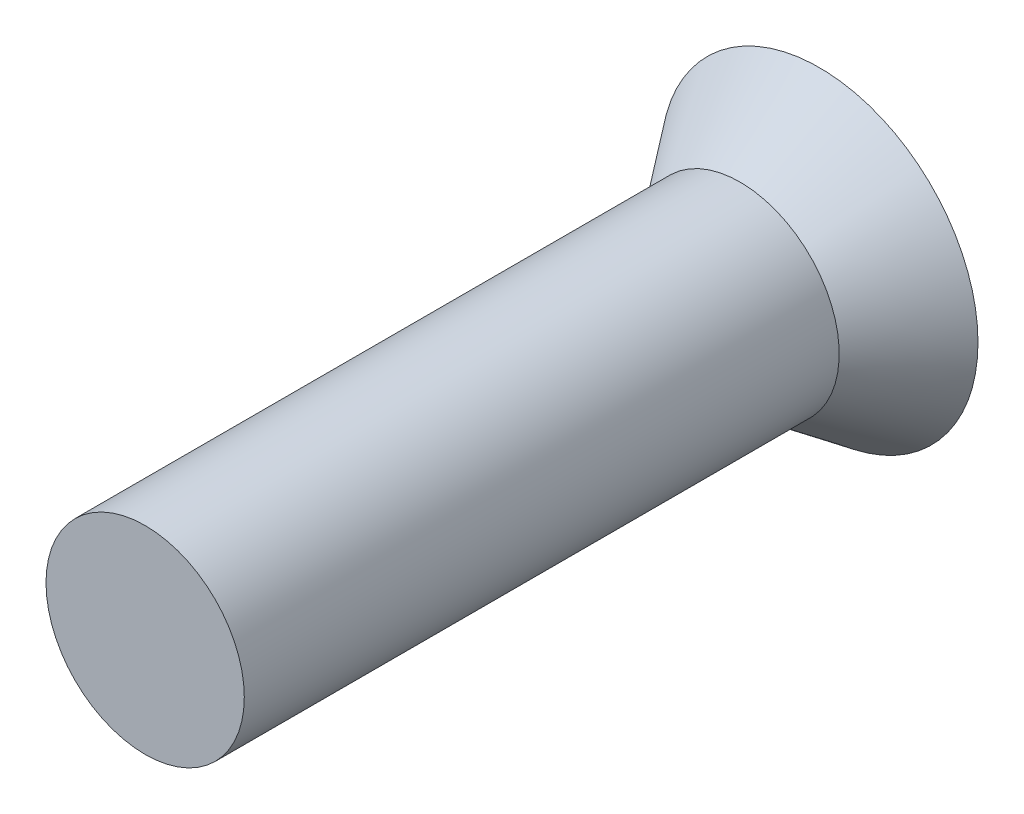
ISO-10303-21;
HEADER;
FILE_DESCRIPTION(('STEP AP214'),'2;1');
FILE_NAME('part.step','',(''),(''),'','','');
FILE_SCHEMA(('AUTOMOTIVE_DESIGN { 1 0 10303 214 1 1 1 1 }'));
ENDSEC;
DATA;
#1=APPLICATION_CONTEXT('core data for automotive mechanical design processes');
#2=APPLICATION_PROTOCOL_DEFINITION('international standard','automotive_design',2000,#1);
#3=PRODUCT_CONTEXT('',#1,'mechanical');
#4=PRODUCT('Part','Part','',(#3));
#5=PRODUCT_RELATED_PRODUCT_CATEGORY('part','',(#4));
#6=PRODUCT_DEFINITION_FORMATION('','',#4);
#7=PRODUCT_DEFINITION_CONTEXT('part definition',#1,'design');
#8=PRODUCT_DEFINITION('design','',#6,#7);
#9=PRODUCT_DEFINITION_SHAPE('','',#8);
#10=(LENGTH_UNIT() NAMED_UNIT(*) SI_UNIT(.MILLI.,.METRE.));
#11=(NAMED_UNIT(*) PLANE_ANGLE_UNIT() SI_UNIT($,.RADIAN.));
#12=(NAMED_UNIT(*) SI_UNIT($,.STERADIAN.) SOLID_ANGLE_UNIT());
#13=UNCERTAINTY_MEASURE_WITH_UNIT(LENGTH_MEASURE(1.E-05),#10,'distance_accuracy_value','');
#14=(GEOMETRIC_REPRESENTATION_CONTEXT(3) GLOBAL_UNCERTAINTY_ASSIGNED_CONTEXT((#13)) GLOBAL_UNIT_ASSIGNED_CONTEXT((#10,
#11,#12)) REPRESENTATION_CONTEXT('',''));
#15=CARTESIAN_POINT('',(0.,0.,0.));
#16=DIRECTION('',(0.,0.,1.));
#17=DIRECTION('',(1.,0.,0.));
#18=AXIS2_PLACEMENT_3D('',#15,#16,#17);
#19=CARTESIAN_POINT('',(0.,0.,17.));
#20=DIRECTION('',(0.,0.,-1.));
#21=DIRECTION('',(-1.,0.,0.));
#22=AXIS2_PLACEMENT_3D('',#19,#20,#21);
#23=CYLINDRICAL_SURFACE('',#22,2.5);
#24=CARTESIAN_POINT('',(0.,0.,17.));
#25=DIRECTION('',(0.,0.,1.));
#26=DIRECTION('',(1.,0.,0.));
#27=AXIS2_PLACEMENT_3D('',#24,#25,#26);
#28=CIRCLE('',#27,2.5);
#29=CARTESIAN_POINT('',(2.5,0.,17.));
#30=VERTEX_POINT('',#29);
#31=EDGE_CURVE('E10',#30,#30,#28,.T.);
#32=ORIENTED_EDGE('',*,*,#31,.F.);
#33=EDGE_LOOP('',(#32));
#34=FACE_BOUND('',#33,.T.);
#35=CARTESIAN_POINT('',(0.,0.,2.));
#36=DIRECTION('',(0.,0.,-1.));
#37=DIRECTION('',(-1.,0.,0.));
#38=AXIS2_PLACEMENT_3D('',#35,#36,#37);
#39=CIRCLE('',#38,2.5);
#40=CARTESIAN_POINT('',(-2.5,0.,2.));
#41=VERTEX_POINT('',#40);
#42=EDGE_CURVE('E51',#41,#41,#39,.T.);
#43=ORIENTED_EDGE('',*,*,#42,.F.);
#44=EDGE_LOOP('',(#43));
#45=FACE_BOUND('',#44,.T.);
#46=ADVANCED_FACE('F43',(#34,#45),#23,.T.);
#47=CARTESIAN_POINT('',(0.,0.,17.));
#48=DIRECTION('',(0.,0.,1.));
#49=DIRECTION('',(1.,0.,0.));
#50=AXIS2_PLACEMENT_3D('',#47,#48,#49);
#51=PLANE('',#50);
#52=ORIENTED_EDGE('',*,*,#31,.T.);
#53=EDGE_LOOP('',(#52));
#54=FACE_BOUND('',#53,.T.);
#55=ADVANCED_FACE('F66',(#54),#51,.T.);
#56=CARTESIAN_POINT('',(0.,0.,0.));
#57=DIRECTION('',(0.,0.,-1.));
#58=DIRECTION('',(-1.,0.,0.));
#59=AXIS2_PLACEMENT_3D('',#56,#57,#58);
#60=CONICAL_SURFACE('',#59,4.,0.643501108793284);
#61=ORIENTED_EDGE('',*,*,#42,.T.);
#62=EDGE_LOOP('',(#61));
#63=FACE_BOUND('',#62,.T.);
#64=CARTESIAN_POINT('',(0.,0.,0.));
#65=DIRECTION('',(0.,0.,-1.));
#66=DIRECTION('',(-1.,0.,0.));
#67=AXIS2_PLACEMENT_3D('',#64,#65,#66);
#68=CIRCLE('',#67,4.);
#69=CARTESIAN_POINT('',(-4.,0.,0.));
#70=VERTEX_POINT('',#69);
#71=EDGE_CURVE('E57',#70,#70,#68,.T.);
#72=ORIENTED_EDGE('',*,*,#71,.F.);
#73=EDGE_LOOP('',(#72));
#74=FACE_BOUND('',#73,.T.);
#75=ADVANCED_FACE('F61',(#63,#74),#60,.T.);
#76=CARTESIAN_POINT('',(0.,0.,0.));
#77=DIRECTION('',(0.,0.,1.));
#78=DIRECTION('',(1.,0.,0.));
#79=AXIS2_PLACEMENT_3D('',#76,#77,#78);
#80=PLANE('',#79);
#81=ORIENTED_EDGE('',*,*,#71,.T.);
#82=EDGE_LOOP('',(#81));
#83=FACE_BOUND('',#82,.T.);
#84=ADVANCED_FACE('F44',(#83),#80,.F.);
#85=CLOSED_SHELL('',(#46,#55,#75,#84));
#86=MANIFOLD_SOLID_BREP('B2',#85);
#87=ADVANCED_BREP_SHAPE_REPRESENTATION('',(#18,#86),#14);
#88=SHAPE_DEFINITION_REPRESENTATION(#9,#87);
ENDSEC;
END-ISO-10303-21;
